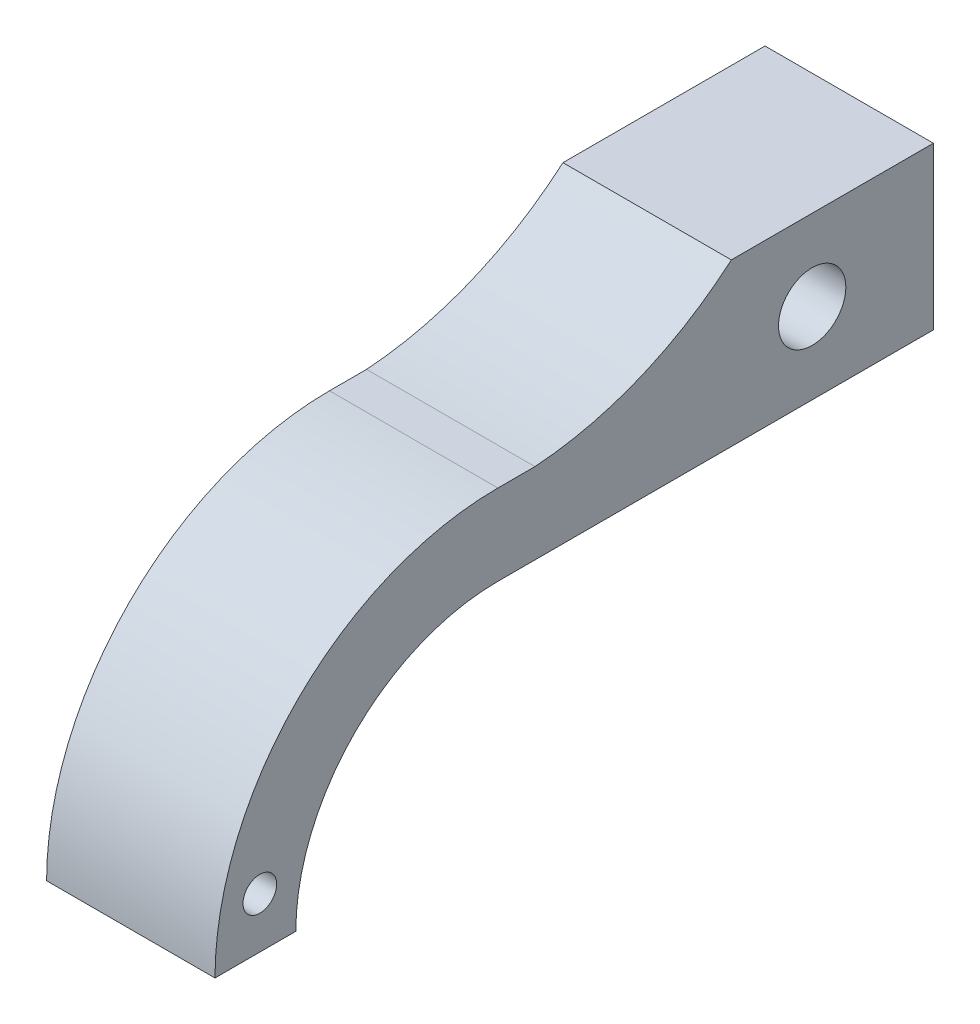
ISO-10303-21;
HEADER;
FILE_DESCRIPTION(('STEP AP214'),'2;1');
FILE_NAME('part.step','',(''),(''),'','','');
FILE_SCHEMA(('AUTOMOTIVE_DESIGN { 1 0 10303 214 1 1 1 1 }'));
ENDSEC;
DATA;
#1=APPLICATION_CONTEXT('core data for automotive mechanical design processes');
#2=APPLICATION_PROTOCOL_DEFINITION('international standard','automotive_design',2000,#1);
#3=PRODUCT_CONTEXT('',#1,'mechanical');
#4=PRODUCT('Part','Part','',(#3));
#5=PRODUCT_RELATED_PRODUCT_CATEGORY('part','',(#4));
#6=PRODUCT_DEFINITION_FORMATION('','',#4);
#7=PRODUCT_DEFINITION_CONTEXT('part definition',#1,'design');
#8=PRODUCT_DEFINITION('design','',#6,#7);
#9=PRODUCT_DEFINITION_SHAPE('','',#8);
#10=(LENGTH_UNIT() NAMED_UNIT(*) SI_UNIT(.MILLI.,.METRE.));
#11=(NAMED_UNIT(*) PLANE_ANGLE_UNIT() SI_UNIT($,.RADIAN.));
#12=(NAMED_UNIT(*) SI_UNIT($,.STERADIAN.) SOLID_ANGLE_UNIT());
#13=UNCERTAINTY_MEASURE_WITH_UNIT(LENGTH_MEASURE(1.E-05),#10,'distance_accuracy_value','');
#14=(GEOMETRIC_REPRESENTATION_CONTEXT(3) GLOBAL_UNCERTAINTY_ASSIGNED_CONTEXT((#13)) GLOBAL_UNIT_ASSIGNED_CONTEXT((#10,
#11,#12)) REPRESENTATION_CONTEXT('',''));
#15=CARTESIAN_POINT('',(0.,0.,0.));
#16=DIRECTION('',(0.,0.,1.));
#17=DIRECTION('',(1.,0.,0.));
#18=AXIS2_PLACEMENT_3D('',#15,#16,#17);
#19=CARTESIAN_POINT('',(25.,-44.925741650937,38.));
#20=DIRECTION('',(-1.,0.,0.));
#21=DIRECTION('',(0.,0.,1.));
#22=AXIS2_PLACEMENT_3D('',#19,#20,#21);
#23=CYLINDRICAL_SURFACE('',#22,42.);
#24=CARTESIAN_POINT('',(0.,-44.925741650937,38.));
#25=DIRECTION('',(1.,0.,0.));
#26=DIRECTION('',(0.,0.,-1.));
#27=AXIS2_PLACEMENT_3D('',#24,#25,#26);
#28=CIRCLE('',#27,42.);
#29=CARTESIAN_POINT('',(0.,-2.92574165093696,38.));
#30=VERTEX_POINT('',#29);
#31=CARTESIAN_POINT('',(0.,-44.925741650937,80.));
#32=VERTEX_POINT('',#31);
#33=EDGE_CURVE('E129',#30,#32,#28,.T.);
#34=ORIENTED_EDGE('',*,*,#33,.T.);
#35=DIRECTION('',(-1.,0.,0.));
#36=VECTOR('',#35,1.);
#37=CARTESIAN_POINT('',(25.,-44.925741650937,80.));
#38=LINE('',#37,#36);
#39=CARTESIAN_POINT('',(25.,-44.925741650937,80.));
#40=VERTEX_POINT('',#39);
#41=EDGE_CURVE('E11',#40,#32,#38,.T.);
#42=ORIENTED_EDGE('',*,*,#41,.F.);
#43=CARTESIAN_POINT('',(25.,-44.925741650937,38.));
#44=DIRECTION('',(1.,0.,0.));
#45=DIRECTION('',(0.,0.,-1.));
#46=AXIS2_PLACEMENT_3D('',#43,#44,#45);
#47=CIRCLE('',#46,42.);
#48=CARTESIAN_POINT('',(25.,-2.92574165093696,38.));
#49=VERTEX_POINT('',#48);
#50=EDGE_CURVE('E145',#49,#40,#47,.T.);
#51=ORIENTED_EDGE('',*,*,#50,.F.);
#52=DIRECTION('',(-1.,0.,0.));
#53=VECTOR('',#52,1.);
#54=CARTESIAN_POINT('',(25.,-2.92574165093696,38.));
#55=LINE('',#54,#53);
#56=EDGE_CURVE('E125',#49,#30,#55,.T.);
#57=ORIENTED_EDGE('',*,*,#56,.T.);
#58=EDGE_LOOP('',(#34,#42,#51,#57));
#59=FACE_BOUND('',#58,.T.);
#60=ADVANCED_FACE('F33',(#59),#23,.T.);
#61=CARTESIAN_POINT('',(25.,-44.925741650937,80.));
#62=DIRECTION('',(0.,1.,0.));
#63=DIRECTION('',(0.,0.,1.));
#64=AXIS2_PLACEMENT_3D('',#61,#62,#63);
#65=PLANE('',#64);
#66=DIRECTION('',(0.,0.,-1.));
#67=VECTOR('',#66,1.);
#68=CARTESIAN_POINT('',(0.,-44.925741650937,80.));
#69=LINE('',#68,#67);
#70=CARTESIAN_POINT('',(0.,-44.9257416509369,68.));
#71=VERTEX_POINT('',#70);
#72=EDGE_CURVE('E132',#32,#71,#69,.T.);
#73=ORIENTED_EDGE('',*,*,#72,.T.);
#74=DIRECTION('',(-1.,0.,0.));
#75=VECTOR('',#74,1.);
#76=CARTESIAN_POINT('',(25.,-44.9257416509369,68.));
#77=LINE('',#76,#75);
#78=CARTESIAN_POINT('',(25.,-44.9257416509369,68.));
#79=VERTEX_POINT('',#78);
#80=EDGE_CURVE('E41',#79,#71,#77,.T.);
#81=ORIENTED_EDGE('',*,*,#80,.F.);
#82=DIRECTION('',(0.,0.,-1.));
#83=VECTOR('',#82,1.);
#84=CARTESIAN_POINT('',(25.,-44.925741650937,80.));
#85=LINE('',#84,#83);
#86=EDGE_CURVE('E92',#40,#79,#85,.T.);
#87=ORIENTED_EDGE('',*,*,#86,.F.);
#88=ORIENTED_EDGE('',*,*,#41,.T.);
#89=EDGE_LOOP('',(#73,#81,#87,#88));
#90=FACE_BOUND('',#89,.T.);
#91=ADVANCED_FACE('F214',(#90),#65,.F.);
#92=CARTESIAN_POINT('',(25.,-44.925741650937,38.));
#93=DIRECTION('',(-1.,0.,0.));
#94=DIRECTION('',(0.,0.,1.));
#95=AXIS2_PLACEMENT_3D('',#92,#93,#94);
#96=CYLINDRICAL_SURFACE('',#95,30.);
#97=CARTESIAN_POINT('',(0.,-44.925741650937,38.));
#98=DIRECTION('',(-1.,0.,0.));
#99=DIRECTION('',(0.,0.,-1.));
#100=AXIS2_PLACEMENT_3D('',#97,#98,#99);
#101=CIRCLE('',#100,30.);
#102=CARTESIAN_POINT('',(0.,-14.925741650937,38.));
#103=VERTEX_POINT('',#102);
#104=EDGE_CURVE('E135',#71,#103,#101,.T.);
#105=ORIENTED_EDGE('',*,*,#104,.T.);
#106=DIRECTION('',(-1.,0.,0.));
#107=VECTOR('',#106,1.);
#108=CARTESIAN_POINT('',(25.,-14.925741650937,38.));
#109=LINE('',#108,#107);
#110=CARTESIAN_POINT('',(25.,-14.925741650937,38.));
#111=VERTEX_POINT('',#110);
#112=EDGE_CURVE('E152',#111,#103,#109,.T.);
#113=ORIENTED_EDGE('',*,*,#112,.F.);
#114=CARTESIAN_POINT('',(25.,-44.925741650937,38.));
#115=DIRECTION('',(-1.,0.,0.));
#116=DIRECTION('',(0.,0.,-1.));
#117=AXIS2_PLACEMENT_3D('',#114,#115,#116);
#118=CIRCLE('',#117,30.);
#119=EDGE_CURVE('E160',#79,#111,#118,.T.);
#120=ORIENTED_EDGE('',*,*,#119,.F.);
#121=ORIENTED_EDGE('',*,*,#80,.T.);
#122=EDGE_LOOP('',(#105,#113,#120,#121));
#123=FACE_BOUND('',#122,.T.);
#124=ADVANCED_FACE('F158',(#123),#96,.F.);
#125=CARTESIAN_POINT('',(25.,-14.9257416509369,-26.6571770636712));
#126=DIRECTION('',(0.,1.,0.));
#127=DIRECTION('',(0.,0.,1.));
#128=AXIS2_PLACEMENT_3D('',#125,#126,#127);
#129=PLANE('',#128);
#130=DIRECTION('',(0.,0.,-1.));
#131=VECTOR('',#130,1.);
#132=CARTESIAN_POINT('',(0.,-14.9257416509369,-26.6571770636712));
#133=LINE('',#132,#131);
#134=CARTESIAN_POINT('',(0.,-14.9257416509369,-26.6571770636712));
#135=VERTEX_POINT('',#134);
#136=EDGE_CURVE('E138',#103,#135,#133,.T.);
#137=ORIENTED_EDGE('',*,*,#136,.T.);
#138=DIRECTION('',(-1.,0.,0.));
#139=VECTOR('',#138,1.);
#140=CARTESIAN_POINT('',(25.,-14.9257416509369,-26.6571770636712));
#141=LINE('',#140,#139);
#142=CARTESIAN_POINT('',(25.,-14.9257416509369,-26.6571770636712));
#143=VERTEX_POINT('',#142);
#144=EDGE_CURVE('E149',#143,#135,#141,.T.);
#145=ORIENTED_EDGE('',*,*,#144,.F.);
#146=DIRECTION('',(0.,0.,-1.));
#147=VECTOR('',#146,1.);
#148=CARTESIAN_POINT('',(25.,-14.925741650937,22.6881503783608));
#149=LINE('',#148,#147);
#150=EDGE_CURVE('E171',#111,#143,#149,.T.);
#151=ORIENTED_EDGE('',*,*,#150,.F.);
#152=ORIENTED_EDGE('',*,*,#112,.T.);
#153=EDGE_LOOP('',(#137,#145,#151,#152));
#154=FACE_BOUND('',#153,.T.);
#155=ADVANCED_FACE('F167',(#154),#129,.F.);
#156=CARTESIAN_POINT('',(25.,-14.9257416509369,-26.6571770636712));
#157=DIRECTION('',(0.,0.,1.));
#158=DIRECTION('',(1.,0.,0.));
#159=AXIS2_PLACEMENT_3D('',#156,#157,#158);
#160=PLANE('',#159);
#161=DIRECTION('',(0.,1.,0.));
#162=VECTOR('',#161,1.);
#163=CARTESIAN_POINT('',(0.,-14.9257416509369,-26.6571770636712));
#164=LINE('',#163,#162);
#165=CARTESIAN_POINT('',(0.,9.07425834906305,-26.6571770636712));
#166=VERTEX_POINT('',#165);
#167=EDGE_CURVE('E140',#135,#166,#164,.T.);
#168=ORIENTED_EDGE('',*,*,#167,.T.);
#169=DIRECTION('',(-1.,0.,0.));
#170=VECTOR('',#169,1.);
#171=CARTESIAN_POINT('',(25.,9.07425834906305,-26.6571770636712));
#172=LINE('',#171,#170);
#173=CARTESIAN_POINT('',(25.,9.07425834906305,-26.6571770636712));
#174=VERTEX_POINT('',#173);
#175=EDGE_CURVE('E120',#174,#166,#172,.T.);
#176=ORIENTED_EDGE('',*,*,#175,.F.);
#177=DIRECTION('',(0.,1.,0.));
#178=VECTOR('',#177,1.);
#179=CARTESIAN_POINT('',(25.,-14.9257416509369,-26.6571770636712));
#180=LINE('',#179,#178);
#181=EDGE_CURVE('E111',#143,#174,#180,.T.);
#182=ORIENTED_EDGE('',*,*,#181,.F.);
#183=ORIENTED_EDGE('',*,*,#144,.T.);
#184=EDGE_LOOP('',(#168,#176,#182,#183));
#185=FACE_BOUND('',#184,.T.);
#186=ADVANCED_FACE('F170',(#185),#160,.F.);
#187=CARTESIAN_POINT('',(25.,9.07425834906305,-26.6571770636712));
#188=DIRECTION('',(0.,-1.,0.));
#189=DIRECTION('',(0.,0.,-1.));
#190=AXIS2_PLACEMENT_3D('',#187,#188,#189);
#191=PLANE('',#190);
#192=DIRECTION('',(0.,0.,1.));
#193=VECTOR('',#192,1.);
#194=CARTESIAN_POINT('',(0.,9.07425834906305,-26.6571770636712));
#195=LINE('',#194,#193);
#196=CARTESIAN_POINT('',(0.,9.07425834906305,3.3428229363288));
#197=VERTEX_POINT('',#196);
#198=EDGE_CURVE('E119',#166,#197,#195,.T.);
#199=ORIENTED_EDGE('',*,*,#198,.T.);
#200=DIRECTION('',(-1.,0.,0.));
#201=VECTOR('',#200,1.);
#202=CARTESIAN_POINT('',(25.,9.07425834906305,3.3428229363288));
#203=LINE('',#202,#201);
#204=CARTESIAN_POINT('',(25.,9.07425834906305,3.3428229363288));
#205=VERTEX_POINT('',#204);
#206=EDGE_CURVE('E116',#205,#197,#203,.T.);
#207=ORIENTED_EDGE('',*,*,#206,.F.);
#208=DIRECTION('',(0.,0.,1.));
#209=VECTOR('',#208,1.);
#210=CARTESIAN_POINT('',(25.,9.07425834906305,-26.6571770636712));
#211=LINE('',#210,#209);
#212=EDGE_CURVE('E105',#174,#205,#211,.T.);
#213=ORIENTED_EDGE('',*,*,#212,.F.);
#214=ORIENTED_EDGE('',*,*,#175,.T.);
#215=EDGE_LOOP('',(#199,#207,#213,#214));
#216=FACE_BOUND('',#215,.T.);
#217=ADVANCED_FACE('F117',(#216),#191,.F.);
#218=CARTESIAN_POINT('',(25.,46.9526976096683,35.9805900042616));
#219=DIRECTION('',(-1.,0.,0.));
#220=DIRECTION('',(0.,0.,1.));
#221=AXIS2_PLACEMENT_3D('',#218,#219,#220);
#222=CYLINDRICAL_SURFACE('',#221,50.);
#223=CARTESIAN_POINT('',(0.,46.9526976096683,35.9805900042616));
#224=DIRECTION('',(-1.,0.,0.));
#225=DIRECTION('',(0.,0.,-1.));
#226=AXIS2_PLACEMENT_3D('',#223,#224,#225);
#227=CIRCLE('',#226,50.);
#228=CARTESIAN_POINT('',(0.,-2.92574165093696,32.4961536185439));
#229=VERTEX_POINT('',#228);
#230=EDGE_CURVE('E78',#197,#229,#227,.T.);
#231=ORIENTED_EDGE('',*,*,#230,.T.);
#232=DIRECTION('',(-1.,0.,0.));
#233=VECTOR('',#232,1.);
#234=CARTESIAN_POINT('',(25.,-2.92574165093696,32.4961536185439));
#235=LINE('',#234,#233);
#236=CARTESIAN_POINT('',(25.,-2.92574165093696,32.4961536185439));
#237=VERTEX_POINT('',#236);
#238=EDGE_CURVE('E121',#237,#229,#235,.T.);
#239=ORIENTED_EDGE('',*,*,#238,.F.);
#240=CARTESIAN_POINT('',(25.,46.9526976096683,35.9805900042616));
#241=DIRECTION('',(-1.,0.,0.));
#242=DIRECTION('',(0.,0.,-1.));
#243=AXIS2_PLACEMENT_3D('',#240,#241,#242);
#244=CIRCLE('',#243,50.);
#245=EDGE_CURVE('E109',#205,#237,#244,.T.);
#246=ORIENTED_EDGE('',*,*,#245,.F.);
#247=ORIENTED_EDGE('',*,*,#206,.T.);
#248=EDGE_LOOP('',(#231,#239,#246,#247));
#249=FACE_BOUND('',#248,.T.);
#250=ADVANCED_FACE('F123',(#249),#222,.F.);
#251=CARTESIAN_POINT('',(25.,-2.92574165093696,32.4961536185439));
#252=DIRECTION('',(0.,-1.,0.));
#253=DIRECTION('',(0.,0.,-1.));
#254=AXIS2_PLACEMENT_3D('',#251,#252,#253);
#255=PLANE('',#254);
#256=DIRECTION('',(0.,0.,1.));
#257=VECTOR('',#256,1.);
#258=CARTESIAN_POINT('',(0.,-2.92574165093696,32.4961536185439));
#259=LINE('',#258,#257);
#260=EDGE_CURVE('E84',#229,#30,#259,.T.);
#261=ORIENTED_EDGE('',*,*,#260,.T.);
#262=ORIENTED_EDGE('',*,*,#56,.F.);
#263=DIRECTION('',(0.,0.,1.));
#264=VECTOR('',#263,1.);
#265=CARTESIAN_POINT('',(25.,-2.92574165093696,32.4961536185439));
#266=LINE('',#265,#264);
#267=EDGE_CURVE('E49',#237,#49,#266,.T.);
#268=ORIENTED_EDGE('',*,*,#267,.F.);
#269=ORIENTED_EDGE('',*,*,#238,.T.);
#270=EDGE_LOOP('',(#261,#262,#268,#269));
#271=FACE_BOUND('',#270,.T.);
#272=ADVANCED_FACE('F200',(#271),#255,.F.);
#273=CARTESIAN_POINT('',(25.,-44.925741650937,38.));
#274=DIRECTION('',(1.,0.,0.));
#275=DIRECTION('',(0.,0.,-1.));
#276=AXIS2_PLACEMENT_3D('',#273,#274,#275);
#277=PLANE('',#276);
#278=CARTESIAN_POINT('',(25.,-37.425741650937,73.3428229363288));
#279=DIRECTION('',(1.,0.,0.));
#280=DIRECTION('',(0.,0.,-1.));
#281=AXIS2_PLACEMENT_3D('',#278,#279,#280);
#282=CIRCLE('',#281,2.5);
#283=CARTESIAN_POINT('',(25.,-37.425741650937,70.8428229363288));
#284=VERTEX_POINT('',#283);
#285=EDGE_CURVE('E183',#284,#284,#282,.T.);
#286=ORIENTED_EDGE('',*,*,#285,.F.);
#287=EDGE_LOOP('',(#286));
#288=FACE_BOUND('',#287,.T.);
#289=CARTESIAN_POINT('',(25.,-2.92574165093695,-8.65717706367119));
#290=DIRECTION('',(1.,0.,0.));
#291=DIRECTION('',(0.,0.,-1.));
#292=AXIS2_PLACEMENT_3D('',#289,#290,#291);
#293=CIRCLE('',#292,5.);
#294=CARTESIAN_POINT('',(25.,-2.92574165093695,-13.6571770636712));
#295=VERTEX_POINT('',#294);
#296=EDGE_CURVE('E177',#295,#295,#293,.T.);
#297=ORIENTED_EDGE('',*,*,#296,.F.);
#298=EDGE_LOOP('',(#297));
#299=FACE_BOUND('',#298,.T.);
#300=ORIENTED_EDGE('',*,*,#50,.T.);
#301=ORIENTED_EDGE('',*,*,#86,.T.);
#302=ORIENTED_EDGE('',*,*,#119,.T.);
#303=ORIENTED_EDGE('',*,*,#150,.T.);
#304=ORIENTED_EDGE('',*,*,#181,.T.);
#305=ORIENTED_EDGE('',*,*,#212,.T.);
#306=ORIENTED_EDGE('',*,*,#245,.T.);
#307=ORIENTED_EDGE('',*,*,#267,.T.);
#308=EDGE_LOOP('',(#300,#301,#302,#303,#304,#305,#306,#307));
#309=FACE_BOUND('',#308,.T.);
#310=ADVANCED_FACE('F107',(#288,#299,#309),#277,.T.);
#311=CARTESIAN_POINT('',(0.,-44.925741650937,38.));
#312=DIRECTION('',(1.,0.,0.));
#313=DIRECTION('',(0.,0.,-1.));
#314=AXIS2_PLACEMENT_3D('',#311,#312,#313);
#315=PLANE('',#314);
#316=CARTESIAN_POINT('',(0.,-37.425741650937,73.3428229363288));
#317=DIRECTION('',(1.,0.,0.));
#318=DIRECTION('',(0.,0.,-1.));
#319=AXIS2_PLACEMENT_3D('',#316,#317,#318);
#320=CIRCLE('',#319,2.5);
#321=CARTESIAN_POINT('',(0.,-37.425741650937,70.8428229363288));
#322=VERTEX_POINT('',#321);
#323=EDGE_CURVE('E180',#322,#322,#320,.T.);
#324=ORIENTED_EDGE('',*,*,#323,.T.);
#325=EDGE_LOOP('',(#324));
#326=FACE_BOUND('',#325,.T.);
#327=CARTESIAN_POINT('',(0.,-2.92574165093695,-8.65717706367119));
#328=DIRECTION('',(1.,0.,0.));
#329=DIRECTION('',(0.,0.,-1.));
#330=AXIS2_PLACEMENT_3D('',#327,#328,#329);
#331=CIRCLE('',#330,5.);
#332=CARTESIAN_POINT('',(0.,-2.92574165093695,-13.6571770636712));
#333=VERTEX_POINT('',#332);
#334=EDGE_CURVE('E133',#333,#333,#331,.T.);
#335=ORIENTED_EDGE('',*,*,#334,.T.);
#336=EDGE_LOOP('',(#335));
#337=FACE_BOUND('',#336,.T.);
#338=ORIENTED_EDGE('',*,*,#33,.F.);
#339=ORIENTED_EDGE('',*,*,#260,.F.);
#340=ORIENTED_EDGE('',*,*,#230,.F.);
#341=ORIENTED_EDGE('',*,*,#198,.F.);
#342=ORIENTED_EDGE('',*,*,#167,.F.);
#343=ORIENTED_EDGE('',*,*,#136,.F.);
#344=ORIENTED_EDGE('',*,*,#104,.F.);
#345=ORIENTED_EDGE('',*,*,#72,.F.);
#346=EDGE_LOOP('',(#338,#339,#340,#341,#342,#343,#344,#345));
#347=FACE_BOUND('',#346,.T.);
#348=ADVANCED_FACE('F163',(#326,#337,#347),#315,.F.);
#349=CARTESIAN_POINT('',(0.,-2.92574165093695,-8.65717706367119));
#350=DIRECTION('',(1.,0.,0.));
#351=DIRECTION('',(0.,0.,-1.));
#352=AXIS2_PLACEMENT_3D('',#349,#350,#351);
#353=CYLINDRICAL_SURFACE('',#352,5.);
#354=ORIENTED_EDGE('',*,*,#334,.F.);
#355=EDGE_LOOP('',(#354));
#356=FACE_BOUND('',#355,.T.);
#357=ORIENTED_EDGE('',*,*,#296,.T.);
#358=EDGE_LOOP('',(#357));
#359=FACE_BOUND('',#358,.T.);
#360=ADVANCED_FACE('F194',(#356,#359),#353,.F.);
#361=CARTESIAN_POINT('',(0.,-37.425741650937,73.3428229363288));
#362=DIRECTION('',(1.,0.,0.));
#363=DIRECTION('',(0.,0.,-1.));
#364=AXIS2_PLACEMENT_3D('',#361,#362,#363);
#365=CYLINDRICAL_SURFACE('',#364,2.5);
#366=ORIENTED_EDGE('',*,*,#323,.F.);
#367=EDGE_LOOP('',(#366));
#368=FACE_BOUND('',#367,.T.);
#369=ORIENTED_EDGE('',*,*,#285,.T.);
#370=EDGE_LOOP('',(#369));
#371=FACE_BOUND('',#370,.T.);
#372=ADVANCED_FACE('F191',(#368,#371),#365,.F.);
#373=CLOSED_SHELL('',(#60,#91,#124,#155,#186,#217,#250,#272,#310,#348,#360,#372));
#374=MANIFOLD_SOLID_BREP('B2',#373);
#375=ADVANCED_BREP_SHAPE_REPRESENTATION('',(#18,#374),#14);
#376=SHAPE_DEFINITION_REPRESENTATION(#9,#375);
ENDSEC;
END-ISO-10303-21;
